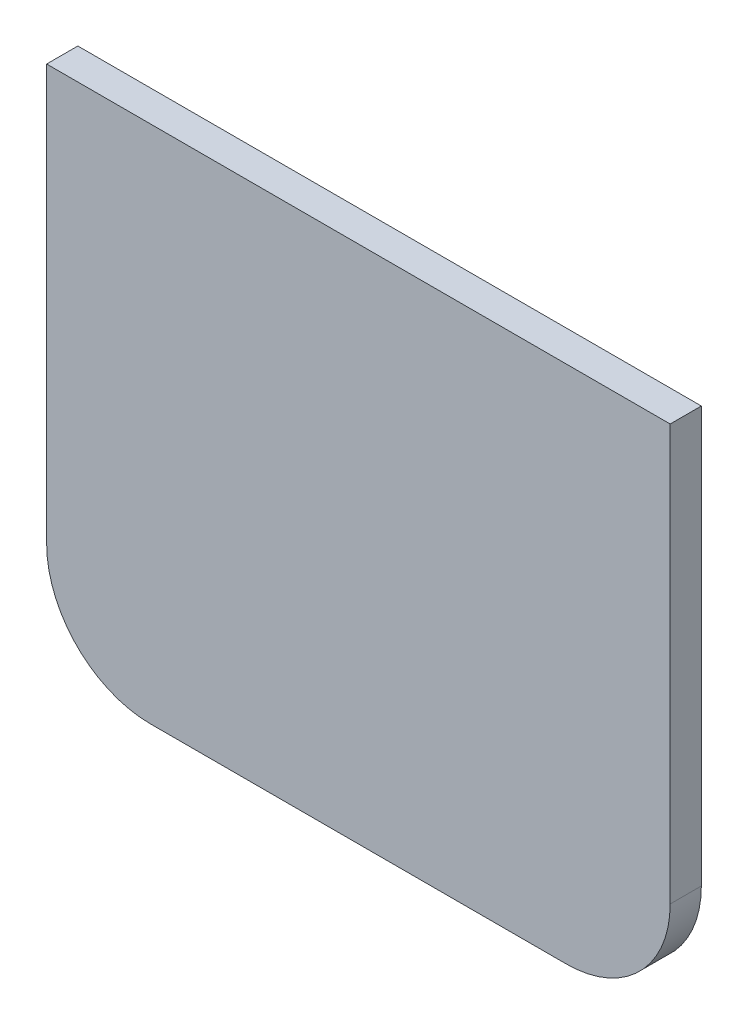
ISO-10303-21;
HEADER;
FILE_DESCRIPTION(('STEP AP214'),'2;1');
FILE_NAME('part.step','',(''),(''),'','','');
FILE_SCHEMA(('AUTOMOTIVE_DESIGN { 1 0 10303 214 1 1 1 1 }'));
ENDSEC;
DATA;
#1=APPLICATION_CONTEXT('core data for automotive mechanical design processes');
#2=APPLICATION_PROTOCOL_DEFINITION('international standard','automotive_design',2000,#1);
#3=PRODUCT_CONTEXT('',#1,'mechanical');
#4=PRODUCT('Part','Part','',(#3));
#5=PRODUCT_RELATED_PRODUCT_CATEGORY('part','',(#4));
#6=PRODUCT_DEFINITION_FORMATION('','',#4);
#7=PRODUCT_DEFINITION_CONTEXT('part definition',#1,'design');
#8=PRODUCT_DEFINITION('design','',#6,#7);
#9=PRODUCT_DEFINITION_SHAPE('','',#8);
#10=(LENGTH_UNIT() NAMED_UNIT(*) SI_UNIT(.MILLI.,.METRE.));
#11=(NAMED_UNIT(*) PLANE_ANGLE_UNIT() SI_UNIT($,.RADIAN.));
#12=(NAMED_UNIT(*) SI_UNIT($,.STERADIAN.) SOLID_ANGLE_UNIT());
#13=UNCERTAINTY_MEASURE_WITH_UNIT(LENGTH_MEASURE(1.E-05),#10,'distance_accuracy_value','');
#14=(GEOMETRIC_REPRESENTATION_CONTEXT(3) GLOBAL_UNCERTAINTY_ASSIGNED_CONTEXT((#13)) GLOBAL_UNIT_ASSIGNED_CONTEXT((#10,
#11,#12)) REPRESENTATION_CONTEXT('',''));
#15=CARTESIAN_POINT('',(0.,0.,0.));
#16=DIRECTION('',(0.,0.,1.));
#17=DIRECTION('',(1.,0.,0.));
#18=AXIS2_PLACEMENT_3D('',#15,#16,#17);
#19=CARTESIAN_POINT('',(150.,-74.9999999999997,15.));
#20=DIRECTION('',(-1.,0.,0.));
#21=DIRECTION('',(0.,0.,1.));
#22=AXIS2_PLACEMENT_3D('',#19,#20,#21);
#23=PLANE('',#22);
#24=DIRECTION('',(0.,1.,0.));
#25=VECTOR('',#24,1.);
#26=CARTESIAN_POINT('',(150.,-74.9999999999997,0.));
#27=LINE('',#26,#25);
#28=CARTESIAN_POINT('',(150.,-74.9999999999997,0.));
#29=VERTEX_POINT('',#28);
#30=CARTESIAN_POINT('',(150.,125.,0.));
#31=VERTEX_POINT('',#30);
#32=EDGE_CURVE('E116',#29,#31,#27,.T.);
#33=ORIENTED_EDGE('',*,*,#32,.T.);
#34=DIRECTION('',(0.,0.,-1.));
#35=VECTOR('',#34,1.);
#36=CARTESIAN_POINT('',(150.,125.,15.));
#37=LINE('',#36,#35);
#38=CARTESIAN_POINT('',(150.,125.,15.));
#39=VERTEX_POINT('',#38);
#40=EDGE_CURVE('E11',#39,#31,#37,.T.);
#41=ORIENTED_EDGE('',*,*,#40,.F.);
#42=DIRECTION('',(0.,1.,0.));
#43=VECTOR('',#42,1.);
#44=CARTESIAN_POINT('',(150.,-74.9999999999997,15.));
#45=LINE('',#44,#43);
#46=CARTESIAN_POINT('',(150.,-74.9999999999997,15.));
#47=VERTEX_POINT('',#46);
#48=EDGE_CURVE('E126',#47,#39,#45,.T.);
#49=ORIENTED_EDGE('',*,*,#48,.F.);
#50=DIRECTION('',(0.,0.,-1.));
#51=VECTOR('',#50,1.);
#52=CARTESIAN_POINT('',(150.,-74.9999999999997,15.));
#53=LINE('',#52,#51);
#54=EDGE_CURVE('E112',#47,#29,#53,.T.);
#55=ORIENTED_EDGE('',*,*,#54,.T.);
#56=EDGE_LOOP('',(#33,#41,#49,#55));
#57=FACE_BOUND('',#56,.T.);
#58=ADVANCED_FACE('F32',(#57),#23,.F.);
#59=CARTESIAN_POINT('',(-150.,125.,15.));
#60=DIRECTION('',(0.,-1.,0.));
#61=DIRECTION('',(0.,0.,-1.));
#62=AXIS2_PLACEMENT_3D('',#59,#60,#61);
#63=PLANE('',#62);
#64=DIRECTION('',(-1.,0.,0.));
#65=VECTOR('',#64,1.);
#66=CARTESIAN_POINT('',(-150.,125.,0.));
#67=LINE('',#66,#65);
#68=CARTESIAN_POINT('',(-150.,125.,0.));
#69=VERTEX_POINT('',#68);
#70=EDGE_CURVE('E119',#31,#69,#67,.T.);
#71=ORIENTED_EDGE('',*,*,#70,.T.);
#72=DIRECTION('',(0.,0.,-1.));
#73=VECTOR('',#72,1.);
#74=CARTESIAN_POINT('',(-150.,125.,15.));
#75=LINE('',#74,#73);
#76=CARTESIAN_POINT('',(-150.,125.,15.));
#77=VERTEX_POINT('',#76);
#78=EDGE_CURVE('E40',#77,#69,#75,.T.);
#79=ORIENTED_EDGE('',*,*,#78,.F.);
#80=DIRECTION('',(-1.,0.,0.));
#81=VECTOR('',#80,1.);
#82=CARTESIAN_POINT('',(-150.,125.,15.));
#83=LINE('',#82,#81);
#84=EDGE_CURVE('E85',#39,#77,#83,.T.);
#85=ORIENTED_EDGE('',*,*,#84,.F.);
#86=ORIENTED_EDGE('',*,*,#40,.T.);
#87=EDGE_LOOP('',(#71,#79,#85,#86));
#88=FACE_BOUND('',#87,.T.);
#89=ADVANCED_FACE('F150',(#88),#63,.F.);
#90=CARTESIAN_POINT('',(-150.,-74.9999999999997,15.));
#91=DIRECTION('',(1.,0.,0.));
#92=DIRECTION('',(0.,0.,-1.));
#93=AXIS2_PLACEMENT_3D('',#90,#91,#92);
#94=PLANE('',#93);
#95=DIRECTION('',(0.,-1.,0.));
#96=VECTOR('',#95,1.);
#97=CARTESIAN_POINT('',(-150.,-74.9999999999997,0.));
#98=LINE('',#97,#96);
#99=CARTESIAN_POINT('',(-150.,-74.9999999999997,0.));
#100=VERTEX_POINT('',#99);
#101=EDGE_CURVE('E121',#69,#100,#98,.T.);
#102=ORIENTED_EDGE('',*,*,#101,.T.);
#103=DIRECTION('',(0.,0.,-1.));
#104=VECTOR('',#103,1.);
#105=CARTESIAN_POINT('',(-150.,-74.9999999999997,15.));
#106=LINE('',#105,#104);
#107=CARTESIAN_POINT('',(-150.,-74.9999999999997,15.));
#108=VERTEX_POINT('',#107);
#109=EDGE_CURVE('E107',#108,#100,#106,.T.);
#110=ORIENTED_EDGE('',*,*,#109,.F.);
#111=DIRECTION('',(0.,-1.,0.));
#112=VECTOR('',#111,1.);
#113=CARTESIAN_POINT('',(-150.,-74.9999999999997,15.));
#114=LINE('',#113,#112);
#115=EDGE_CURVE('E98',#77,#108,#114,.T.);
#116=ORIENTED_EDGE('',*,*,#115,.F.);
#117=ORIENTED_EDGE('',*,*,#78,.T.);
#118=EDGE_LOOP('',(#102,#110,#116,#117));
#119=FACE_BOUND('',#118,.T.);
#120=ADVANCED_FACE('F132',(#119),#94,.F.);
#121=CARTESIAN_POINT('',(-100.,-75.,15.));
#122=DIRECTION('',(0.,0.,-1.));
#123=DIRECTION('',(-1.,0.,0.));
#124=AXIS2_PLACEMENT_3D('',#121,#122,#123);
#125=CYLINDRICAL_SURFACE('',#124,50.);
#126=CARTESIAN_POINT('',(-100.,-75.,0.));
#127=DIRECTION('',(0.,0.,1.));
#128=DIRECTION('',(-1.,0.,0.));
#129=AXIS2_PLACEMENT_3D('',#126,#127,#128);
#130=CIRCLE('',#129,50.);
#131=CARTESIAN_POINT('',(-99.9999999999998,-125.,0.));
#132=VERTEX_POINT('',#131);
#133=EDGE_CURVE('E106',#100,#132,#130,.T.);
#134=ORIENTED_EDGE('',*,*,#133,.T.);
#135=DIRECTION('',(0.,0.,-1.));
#136=VECTOR('',#135,1.);
#137=CARTESIAN_POINT('',(-99.9999999999998,-125.,15.));
#138=LINE('',#137,#136);
#139=CARTESIAN_POINT('',(-99.9999999999998,-125.,15.));
#140=VERTEX_POINT('',#139);
#141=EDGE_CURVE('E103',#140,#132,#138,.T.);
#142=ORIENTED_EDGE('',*,*,#141,.F.);
#143=CARTESIAN_POINT('',(-100.,-75.,15.));
#144=DIRECTION('',(0.,0.,1.));
#145=DIRECTION('',(-1.,0.,0.));
#146=AXIS2_PLACEMENT_3D('',#143,#144,#145);
#147=CIRCLE('',#146,50.);
#148=EDGE_CURVE('E92',#108,#140,#147,.T.);
#149=ORIENTED_EDGE('',*,*,#148,.F.);
#150=ORIENTED_EDGE('',*,*,#109,.T.);
#151=EDGE_LOOP('',(#134,#142,#149,#150));
#152=FACE_BOUND('',#151,.T.);
#153=ADVANCED_FACE('F104',(#152),#125,.T.);
#154=CARTESIAN_POINT('',(-99.9999999999998,-125.,15.));
#155=DIRECTION('',(0.,1.,0.));
#156=DIRECTION('',(0.,0.,1.));
#157=AXIS2_PLACEMENT_3D('',#154,#155,#156);
#158=PLANE('',#157);
#159=DIRECTION('',(1.,0.,0.));
#160=VECTOR('',#159,1.);
#161=CARTESIAN_POINT('',(-99.9999999999998,-125.,0.));
#162=LINE('',#161,#160);
#163=CARTESIAN_POINT('',(99.9999999999995,-125.,0.));
#164=VERTEX_POINT('',#163);
#165=EDGE_CURVE('E71',#132,#164,#162,.T.);
#166=ORIENTED_EDGE('',*,*,#165,.T.);
#167=DIRECTION('',(0.,0.,-1.));
#168=VECTOR('',#167,1.);
#169=CARTESIAN_POINT('',(99.9999999999995,-125.,15.));
#170=LINE('',#169,#168);
#171=CARTESIAN_POINT('',(99.9999999999995,-125.,15.));
#172=VERTEX_POINT('',#171);
#173=EDGE_CURVE('E108',#172,#164,#170,.T.);
#174=ORIENTED_EDGE('',*,*,#173,.F.);
#175=DIRECTION('',(1.,0.,0.));
#176=VECTOR('',#175,1.);
#177=CARTESIAN_POINT('',(-99.9999999999998,-125.,15.));
#178=LINE('',#177,#176);
#179=EDGE_CURVE('E96',#140,#172,#178,.T.);
#180=ORIENTED_EDGE('',*,*,#179,.F.);
#181=ORIENTED_EDGE('',*,*,#141,.T.);
#182=EDGE_LOOP('',(#166,#174,#180,#181));
#183=FACE_BOUND('',#182,.T.);
#184=ADVANCED_FACE('F110',(#183),#158,.F.);
#185=CARTESIAN_POINT('',(99.9999999999999,-75.,15.));
#186=DIRECTION('',(0.,0.,-1.));
#187=DIRECTION('',(-1.,0.,0.));
#188=AXIS2_PLACEMENT_3D('',#185,#186,#187);
#189=CYLINDRICAL_SURFACE('',#188,50.);
#190=CARTESIAN_POINT('',(99.9999999999999,-75.,0.));
#191=DIRECTION('',(0.,0.,1.));
#192=DIRECTION('',(1.,0.,0.));
#193=AXIS2_PLACEMENT_3D('',#190,#191,#192);
#194=CIRCLE('',#193,50.);
#195=EDGE_CURVE('E77',#164,#29,#194,.T.);
#196=ORIENTED_EDGE('',*,*,#195,.T.);
#197=ORIENTED_EDGE('',*,*,#54,.F.);
#198=CARTESIAN_POINT('',(99.9999999999999,-75.,15.));
#199=DIRECTION('',(0.,0.,1.));
#200=DIRECTION('',(1.,0.,0.));
#201=AXIS2_PLACEMENT_3D('',#198,#199,#200);
#202=CIRCLE('',#201,50.);
#203=EDGE_CURVE('E48',#172,#47,#202,.T.);
#204=ORIENTED_EDGE('',*,*,#203,.F.);
#205=ORIENTED_EDGE('',*,*,#173,.T.);
#206=EDGE_LOOP('',(#196,#197,#204,#205));
#207=FACE_BOUND('',#206,.T.);
#208=ADVANCED_FACE('F139',(#207),#189,.T.);
#209=CARTESIAN_POINT('',(-100.,-75.,15.));
#210=DIRECTION('',(0.,0.,-1.));
#211=DIRECTION('',(-1.,0.,0.));
#212=AXIS2_PLACEMENT_3D('',#209,#210,#211);
#213=PLANE('',#212);
#214=ORIENTED_EDGE('',*,*,#48,.T.);
#215=ORIENTED_EDGE('',*,*,#84,.T.);
#216=ORIENTED_EDGE('',*,*,#115,.T.);
#217=ORIENTED_EDGE('',*,*,#148,.T.);
#218=ORIENTED_EDGE('',*,*,#179,.T.);
#219=ORIENTED_EDGE('',*,*,#203,.T.);
#220=EDGE_LOOP('',(#214,#215,#216,#217,#218,#219));
#221=FACE_BOUND('',#220,.T.);
#222=ADVANCED_FACE('F94',(#221),#213,.F.);
#223=CARTESIAN_POINT('',(-100.,-75.,0.));
#224=DIRECTION('',(0.,0.,-1.));
#225=DIRECTION('',(-1.,0.,0.));
#226=AXIS2_PLACEMENT_3D('',#223,#224,#225);
#227=PLANE('',#226);
#228=ORIENTED_EDGE('',*,*,#32,.F.);
#229=ORIENTED_EDGE('',*,*,#195,.F.);
#230=ORIENTED_EDGE('',*,*,#165,.F.);
#231=ORIENTED_EDGE('',*,*,#133,.F.);
#232=ORIENTED_EDGE('',*,*,#101,.F.);
#233=ORIENTED_EDGE('',*,*,#70,.F.);
#234=EDGE_LOOP('',(#228,#229,#230,#231,#232,#233));
#235=FACE_BOUND('',#234,.T.);
#236=ADVANCED_FACE('F135',(#235),#227,.T.);
#237=CLOSED_SHELL('',(#58,#89,#120,#153,#184,#208,#222,#236));
#238=MANIFOLD_SOLID_BREP('B2',#237);
#239=ADVANCED_BREP_SHAPE_REPRESENTATION('',(#18,#238),#14);
#240=SHAPE_DEFINITION_REPRESENTATION(#9,#239);
ENDSEC;
END-ISO-10303-21;
